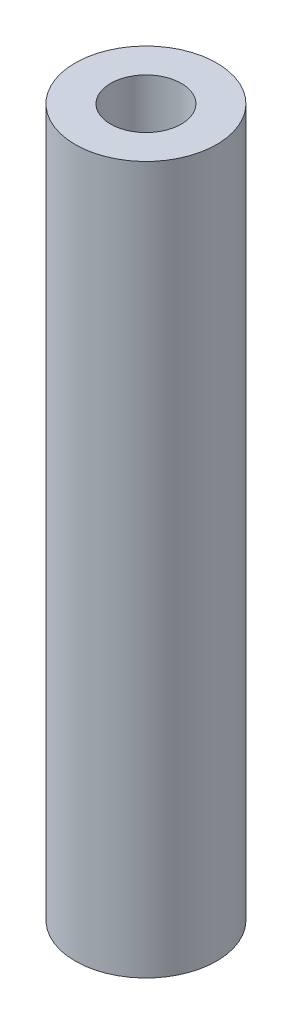
ISO-10303-21;
HEADER;
FILE_DESCRIPTION(('STEP AP214'),'2;1');
FILE_NAME('part.step','',(''),(''),'','','');
FILE_SCHEMA(('AUTOMOTIVE_DESIGN { 1 0 10303 214 1 1 1 1 }'));
ENDSEC;
DATA;
#1=APPLICATION_CONTEXT('core data for automotive mechanical design processes');
#2=APPLICATION_PROTOCOL_DEFINITION('international standard','automotive_design',2000,#1);
#3=PRODUCT_CONTEXT('',#1,'mechanical');
#4=PRODUCT('Part','Part','',(#3));
#5=PRODUCT_RELATED_PRODUCT_CATEGORY('part','',(#4));
#6=PRODUCT_DEFINITION_FORMATION('','',#4);
#7=PRODUCT_DEFINITION_CONTEXT('part definition',#1,'design');
#8=PRODUCT_DEFINITION('design','',#6,#7);
#9=PRODUCT_DEFINITION_SHAPE('','',#8);
#10=(LENGTH_UNIT() NAMED_UNIT(*) SI_UNIT(.MILLI.,.METRE.));
#11=(NAMED_UNIT(*) PLANE_ANGLE_UNIT() SI_UNIT($,.RADIAN.));
#12=(NAMED_UNIT(*) SI_UNIT($,.STERADIAN.) SOLID_ANGLE_UNIT());
#13=UNCERTAINTY_MEASURE_WITH_UNIT(LENGTH_MEASURE(1.E-05),#10,'distance_accuracy_value','');
#14=(GEOMETRIC_REPRESENTATION_CONTEXT(3) GLOBAL_UNCERTAINTY_ASSIGNED_CONTEXT((#13)) GLOBAL_UNIT_ASSIGNED_CONTEXT((#10,
#11,#12)) REPRESENTATION_CONTEXT('',''));
#15=CARTESIAN_POINT('',(0.,0.,0.));
#16=DIRECTION('',(0.,0.,1.));
#17=DIRECTION('',(1.,0.,0.));
#18=AXIS2_PLACEMENT_3D('',#15,#16,#17);
#19=CARTESIAN_POINT('',(0.,50.,0.));
#20=DIRECTION('',(0.,-1.,0.));
#21=DIRECTION('',(0.,0.,-1.));
#22=AXIS2_PLACEMENT_3D('',#19,#20,#21);
#23=CYLINDRICAL_SURFACE('',#22,5.);
#24=CARTESIAN_POINT('',(0.,50.,0.));
#25=DIRECTION('',(0.,1.,0.));
#26=DIRECTION('',(0.,0.,1.));
#27=AXIS2_PLACEMENT_3D('',#24,#25,#26);
#28=CIRCLE('',#27,5.);
#29=CARTESIAN_POINT('',(0.,50.,5.));
#30=VERTEX_POINT('',#29);
#31=EDGE_CURVE('E10',#30,#30,#28,.T.);
#32=ORIENTED_EDGE('',*,*,#31,.F.);
#33=EDGE_LOOP('',(#32));
#34=FACE_BOUND('',#33,.T.);
#35=CARTESIAN_POINT('',(0.,0.,0.));
#36=DIRECTION('',(0.,1.,0.));
#37=DIRECTION('',(0.,0.,1.));
#38=AXIS2_PLACEMENT_3D('',#35,#36,#37);
#39=CIRCLE('',#38,5.);
#40=CARTESIAN_POINT('',(0.,0.,5.));
#41=VERTEX_POINT('',#40);
#42=EDGE_CURVE('E38',#41,#41,#39,.T.);
#43=ORIENTED_EDGE('',*,*,#42,.T.);
#44=EDGE_LOOP('',(#43));
#45=FACE_BOUND('',#44,.T.);
#46=ADVANCED_FACE('F35',(#34,#45),#23,.T.);
#47=CARTESIAN_POINT('',(0.,50.,0.));
#48=DIRECTION('',(0.,1.,0.));
#49=DIRECTION('',(0.,0.,1.));
#50=AXIS2_PLACEMENT_3D('',#47,#48,#49);
#51=PLANE('',#50);
#52=CARTESIAN_POINT('',(0.,50.,0.));
#53=DIRECTION('',(0.,1.,0.));
#54=DIRECTION('',(0.,0.,1.));
#55=AXIS2_PLACEMENT_3D('',#52,#53,#54);
#56=CIRCLE('',#55,2.5);
#57=CARTESIAN_POINT('',(0.,50.,2.5));
#58=VERTEX_POINT('',#57);
#59=EDGE_CURVE('E47',#58,#58,#56,.T.);
#60=ORIENTED_EDGE('',*,*,#59,.F.);
#61=EDGE_LOOP('',(#60));
#62=FACE_BOUND('',#61,.T.);
#63=ORIENTED_EDGE('',*,*,#31,.T.);
#64=EDGE_LOOP('',(#63));
#65=FACE_BOUND('',#64,.T.);
#66=ADVANCED_FACE('F62',(#62,#65),#51,.T.);
#67=CARTESIAN_POINT('',(0.,0.,0.));
#68=DIRECTION('',(0.,1.,0.));
#69=DIRECTION('',(0.,0.,1.));
#70=AXIS2_PLACEMENT_3D('',#67,#68,#69);
#71=PLANE('',#70);
#72=ORIENTED_EDGE('',*,*,#42,.F.);
#73=EDGE_LOOP('',(#72));
#74=FACE_BOUND('',#73,.T.);
#75=ADVANCED_FACE('F58',(#74),#71,.F.);
#76=CARTESIAN_POINT('',(0.,20.,0.));
#77=DIRECTION('',(0.,1.,0.));
#78=DIRECTION('',(0.,0.,1.));
#79=AXIS2_PLACEMENT_3D('',#76,#77,#78);
#80=CYLINDRICAL_SURFACE('',#79,2.5);
#81=CARTESIAN_POINT('',(0.,20.,0.));
#82=DIRECTION('',(0.,1.,0.));
#83=DIRECTION('',(0.,0.,1.));
#84=AXIS2_PLACEMENT_3D('',#81,#82,#83);
#85=CIRCLE('',#84,2.5);
#86=CARTESIAN_POINT('',(0.,20.,2.5));
#87=VERTEX_POINT('',#86);
#88=EDGE_CURVE('E45',#87,#87,#85,.T.);
#89=ORIENTED_EDGE('',*,*,#88,.F.);
#90=EDGE_LOOP('',(#89));
#91=FACE_BOUND('',#90,.T.);
#92=ORIENTED_EDGE('',*,*,#59,.T.);
#93=EDGE_LOOP('',(#92));
#94=FACE_BOUND('',#93,.T.);
#95=ADVANCED_FACE('F55',(#91,#94),#80,.F.);
#96=CARTESIAN_POINT('',(0.,20.,0.));
#97=DIRECTION('',(0.,1.,0.));
#98=DIRECTION('',(0.,0.,1.));
#99=AXIS2_PLACEMENT_3D('',#96,#97,#98);
#100=PLANE('',#99);
#101=ORIENTED_EDGE('',*,*,#88,.T.);
#102=EDGE_LOOP('',(#101));
#103=FACE_BOUND('',#102,.T.);
#104=ADVANCED_FACE('F53',(#103),#100,.T.);
#105=CLOSED_SHELL('',(#46,#66,#75,#95,#104));
#106=MANIFOLD_SOLID_BREP('B2',#105);
#107=ADVANCED_BREP_SHAPE_REPRESENTATION('',(#18,#106),#14);
#108=SHAPE_DEFINITION_REPRESENTATION(#9,#107);
ENDSEC;
END-ISO-10303-21;
